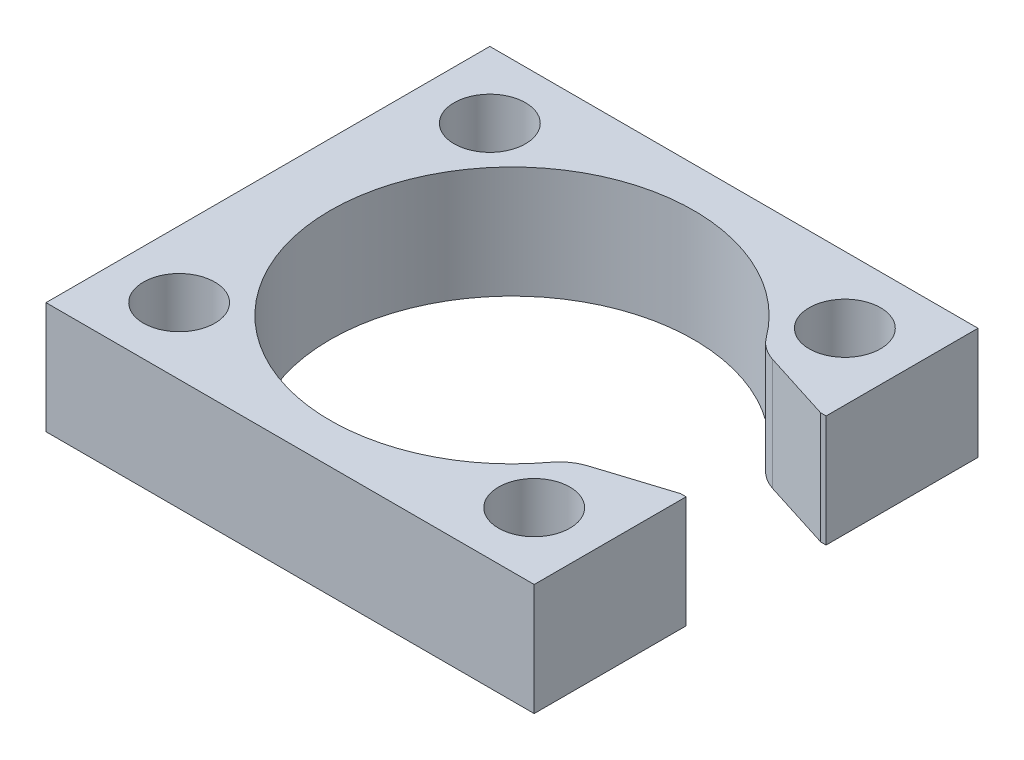
ISO-10303-21;
HEADER;
FILE_DESCRIPTION(('STEP AP214'),'2;1');
FILE_NAME('part.step','',(''),(''),'','','');
FILE_SCHEMA(('AUTOMOTIVE_DESIGN { 1 0 10303 214 1 1 1 1 }'));
ENDSEC;
DATA;
#1=APPLICATION_CONTEXT('core data for automotive mechanical design processes');
#2=APPLICATION_PROTOCOL_DEFINITION('international standard','automotive_design',2000,#1);
#3=PRODUCT_CONTEXT('',#1,'mechanical');
#4=PRODUCT('Part','Part','',(#3));
#5=PRODUCT_RELATED_PRODUCT_CATEGORY('part','',(#4));
#6=PRODUCT_DEFINITION_FORMATION('','',#4);
#7=PRODUCT_DEFINITION_CONTEXT('part definition',#1,'design');
#8=PRODUCT_DEFINITION('design','',#6,#7);
#9=PRODUCT_DEFINITION_SHAPE('','',#8);
#10=(LENGTH_UNIT() NAMED_UNIT(*) SI_UNIT(.MILLI.,.METRE.));
#11=(NAMED_UNIT(*) PLANE_ANGLE_UNIT() SI_UNIT($,.RADIAN.));
#12=(NAMED_UNIT(*) SI_UNIT($,.STERADIAN.) SOLID_ANGLE_UNIT());
#13=UNCERTAINTY_MEASURE_WITH_UNIT(LENGTH_MEASURE(1.E-05),#10,'distance_accuracy_value','');
#14=(GEOMETRIC_REPRESENTATION_CONTEXT(3) GLOBAL_UNCERTAINTY_ASSIGNED_CONTEXT((#13)) GLOBAL_UNIT_ASSIGNED_CONTEXT((#10,
#11,#12)) REPRESENTATION_CONTEXT('',''));
#15=CARTESIAN_POINT('',(0.,0.,0.));
#16=DIRECTION('',(0.,0.,1.));
#17=DIRECTION('',(1.,0.,0.));
#18=AXIS2_PLACEMENT_3D('',#15,#16,#17);
#19=CARTESIAN_POINT('',(17.4625,4.,15.875));
#20=DIRECTION('',(-1.,0.,0.));
#21=DIRECTION('',(0.,0.,1.));
#22=AXIS2_PLACEMENT_3D('',#19,#20,#21);
#23=PLANE('',#22);
#24=DIRECTION('',(0.,0.,-1.));
#25=VECTOR('',#24,1.);
#26=CARTESIAN_POINT('',(17.4625,4.,15.875));
#27=LINE('',#26,#25);
#28=CARTESIAN_POINT('',(17.4625,4.,-5.008));
#29=VERTEX_POINT('',#28);
#30=CARTESIAN_POINT('',(17.4625,4.,-15.875));
#31=VERTEX_POINT('',#30);
#32=EDGE_CURVE('E153',#29,#31,#27,.T.);
#33=ORIENTED_EDGE('',*,*,#32,.F.);
#34=DIRECTION('',(0.,1.,0.));
#35=VECTOR('',#34,1.);
#36=CARTESIAN_POINT('',(17.4625,-4.001,-5.008));
#37=LINE('',#36,#35);
#38=CARTESIAN_POINT('',(17.4625,-4.,-5.008));
#39=VERTEX_POINT('',#38);
#40=EDGE_CURVE('E146',#39,#29,#37,.T.);
#41=ORIENTED_EDGE('',*,*,#40,.F.);
#42=DIRECTION('',(0.,0.,-1.));
#43=VECTOR('',#42,1.);
#44=CARTESIAN_POINT('',(17.4625,-4.,15.875));
#45=LINE('',#44,#43);
#46=CARTESIAN_POINT('',(17.4625,-4.,-15.875));
#47=VERTEX_POINT('',#46);
#48=EDGE_CURVE('E167',#39,#47,#45,.T.);
#49=ORIENTED_EDGE('',*,*,#48,.T.);
#50=DIRECTION('',(0.,-1.,0.));
#51=VECTOR('',#50,1.);
#52=CARTESIAN_POINT('',(17.4625,4.,-15.875));
#53=LINE('',#52,#51);
#54=EDGE_CURVE('E179',#31,#47,#53,.T.);
#55=ORIENTED_EDGE('',*,*,#54,.F.);
#56=EDGE_LOOP('',(#33,#41,#49,#55));
#57=FACE_BOUND('',#56,.T.);
#58=ADVANCED_FACE('F33',(#57),#23,.F.);
#59=CARTESIAN_POINT('',(17.4625,-4.,15.875));
#60=VERTEX_POINT('',#59);
#61=CARTESIAN_POINT('',(17.4625,-4.,5.008));
#62=VERTEX_POINT('',#61);
#63=EDGE_CURVE('E145',#60,#62,#45,.T.);
#64=ORIENTED_EDGE('',*,*,#63,.T.);
#65=DIRECTION('',(0.,-1.,0.));
#66=VECTOR('',#65,1.);
#67=CARTESIAN_POINT('',(17.4625,-4.001,5.008));
#68=LINE('',#67,#66);
#69=CARTESIAN_POINT('',(17.4625,4.,5.008));
#70=VERTEX_POINT('',#69);
#71=EDGE_CURVE('E128',#70,#62,#68,.T.);
#72=ORIENTED_EDGE('',*,*,#71,.F.);
#73=CARTESIAN_POINT('',(17.4625,4.,15.875));
#74=VERTEX_POINT('',#73);
#75=EDGE_CURVE('E143',#74,#70,#27,.T.);
#76=ORIENTED_EDGE('',*,*,#75,.F.);
#77=DIRECTION('',(0.,-1.,0.));
#78=VECTOR('',#77,1.);
#79=CARTESIAN_POINT('',(17.4625,4.,15.875));
#80=LINE('',#79,#78);
#81=EDGE_CURVE('E164',#74,#60,#80,.T.);
#82=ORIENTED_EDGE('',*,*,#81,.T.);
#83=EDGE_LOOP('',(#64,#72,#76,#82));
#84=FACE_BOUND('',#83,.T.);
#85=ADVANCED_FACE('F141',(#84),#23,.F.);
#86=CARTESIAN_POINT('',(-17.4625,4.,-15.875));
#87=DIRECTION('',(0.,0.,1.));
#88=DIRECTION('',(1.,0.,0.));
#89=AXIS2_PLACEMENT_3D('',#86,#87,#88);
#90=PLANE('',#89);
#91=DIRECTION('',(-1.,0.,0.));
#92=VECTOR('',#91,1.);
#93=CARTESIAN_POINT('',(-17.4625,-4.,-15.875));
#94=LINE('',#93,#92);
#95=CARTESIAN_POINT('',(-17.4625,-4.,-15.875));
#96=VERTEX_POINT('',#95);
#97=EDGE_CURVE('E166',#47,#96,#94,.T.);
#98=ORIENTED_EDGE('',*,*,#97,.T.);
#99=DIRECTION('',(0.,-1.,0.));
#100=VECTOR('',#99,1.);
#101=CARTESIAN_POINT('',(-17.4625,4.,-15.875));
#102=LINE('',#101,#100);
#103=CARTESIAN_POINT('',(-17.4625,4.,-15.875));
#104=VERTEX_POINT('',#103);
#105=EDGE_CURVE('E176',#104,#96,#102,.T.);
#106=ORIENTED_EDGE('',*,*,#105,.F.);
#107=DIRECTION('',(-1.,0.,0.));
#108=VECTOR('',#107,1.);
#109=CARTESIAN_POINT('',(-17.4625,4.,-15.875));
#110=LINE('',#109,#108);
#111=EDGE_CURVE('E152',#31,#104,#110,.T.);
#112=ORIENTED_EDGE('',*,*,#111,.F.);
#113=ORIENTED_EDGE('',*,*,#54,.T.);
#114=EDGE_LOOP('',(#98,#106,#112,#113));
#115=FACE_BOUND('',#114,.T.);
#116=ADVANCED_FACE('F261',(#115),#90,.F.);
#117=CARTESIAN_POINT('',(-17.4625,4.,15.875));
#118=DIRECTION('',(1.,0.,0.));
#119=DIRECTION('',(0.,0.,-1.));
#120=AXIS2_PLACEMENT_3D('',#117,#118,#119);
#121=PLANE('',#120);
#122=DIRECTION('',(0.,0.,1.));
#123=VECTOR('',#122,1.);
#124=CARTESIAN_POINT('',(-17.4625,-4.,15.875));
#125=LINE('',#124,#123);
#126=CARTESIAN_POINT('',(-17.4625,-4.,15.875));
#127=VERTEX_POINT('',#126);
#128=EDGE_CURVE('E169',#96,#127,#125,.T.);
#129=ORIENTED_EDGE('',*,*,#128,.T.);
#130=DIRECTION('',(0.,-1.,0.));
#131=VECTOR('',#130,1.);
#132=CARTESIAN_POINT('',(-17.4625,4.,15.875));
#133=LINE('',#132,#131);
#134=CARTESIAN_POINT('',(-17.4625,4.,15.875));
#135=VERTEX_POINT('',#134);
#136=EDGE_CURVE('E173',#135,#127,#133,.T.);
#137=ORIENTED_EDGE('',*,*,#136,.F.);
#138=DIRECTION('',(0.,0.,1.));
#139=VECTOR('',#138,1.);
#140=CARTESIAN_POINT('',(-17.4625,4.,15.875));
#141=LINE('',#140,#139);
#142=EDGE_CURVE('E155',#104,#135,#141,.T.);
#143=ORIENTED_EDGE('',*,*,#142,.F.);
#144=ORIENTED_EDGE('',*,*,#105,.T.);
#145=EDGE_LOOP('',(#129,#137,#143,#144));
#146=FACE_BOUND('',#145,.T.);
#147=ADVANCED_FACE('F411',(#146),#121,.F.);
#148=CARTESIAN_POINT('',(-17.4625,4.,15.875));
#149=DIRECTION('',(0.,0.,-1.));
#150=DIRECTION('',(-1.,0.,0.));
#151=AXIS2_PLACEMENT_3D('',#148,#149,#150);
#152=PLANE('',#151);
#153=DIRECTION('',(1.,0.,0.));
#154=VECTOR('',#153,1.);
#155=CARTESIAN_POINT('',(-17.4625,-4.,15.875));
#156=LINE('',#155,#154);
#157=EDGE_CURVE('E157',#127,#60,#156,.T.);
#158=ORIENTED_EDGE('',*,*,#157,.T.);
#159=ORIENTED_EDGE('',*,*,#81,.F.);
#160=DIRECTION('',(1.,0.,0.));
#161=VECTOR('',#160,1.);
#162=CARTESIAN_POINT('',(-17.4625,4.,15.875));
#163=LINE('',#162,#161);
#164=EDGE_CURVE('E150',#135,#74,#163,.T.);
#165=ORIENTED_EDGE('',*,*,#164,.F.);
#166=ORIENTED_EDGE('',*,*,#136,.T.);
#167=EDGE_LOOP('',(#158,#159,#165,#166));
#168=FACE_BOUND('',#167,.T.);
#169=ADVANCED_FACE('F339',(#168),#152,.F.);
#170=CARTESIAN_POINT('',(0.,4.,0.));
#171=DIRECTION('',(0.,-1.,0.));
#172=DIRECTION('',(0.,0.,-1.));
#173=AXIS2_PLACEMENT_3D('',#170,#171,#172);
#174=PLANE('',#173);
#175=CARTESIAN_POINT('',(-12.7,4.,-11.1125));
#176=DIRECTION('',(0.,1.,0.));
#177=DIRECTION('',(0.,0.,1.));
#178=AXIS2_PLACEMENT_3D('',#175,#176,#177);
#179=CIRCLE('',#178,2.5527);
#180=CARTESIAN_POINT('',(-12.7,4.,-8.5598));
#181=VERTEX_POINT('',#180);
#182=EDGE_CURVE('E205',#181,#181,#179,.T.);
#183=ORIENTED_EDGE('',*,*,#182,.F.);
#184=EDGE_LOOP('',(#183));
#185=FACE_BOUND('',#184,.T.);
#186=CARTESIAN_POINT('',(12.7,4.,-11.1125));
#187=DIRECTION('',(0.,1.,0.));
#188=DIRECTION('',(0.,0.,1.));
#189=AXIS2_PLACEMENT_3D('',#186,#187,#188);
#190=CIRCLE('',#189,2.5527);
#191=CARTESIAN_POINT('',(12.7,4.,-8.5598));
#192=VERTEX_POINT('',#191);
#193=EDGE_CURVE('E232',#192,#192,#190,.T.);
#194=ORIENTED_EDGE('',*,*,#193,.F.);
#195=EDGE_LOOP('',(#194));
#196=FACE_BOUND('',#195,.T.);
#197=CARTESIAN_POINT('',(12.7,4.,11.1125));
#198=DIRECTION('',(0.,1.,0.));
#199=DIRECTION('',(0.,0.,1.));
#200=AXIS2_PLACEMENT_3D('',#197,#198,#199);
#201=CIRCLE('',#200,2.5527);
#202=CARTESIAN_POINT('',(12.7,4.,13.6652));
#203=VERTEX_POINT('',#202);
#204=EDGE_CURVE('E238',#203,#203,#201,.T.);
#205=ORIENTED_EDGE('',*,*,#204,.F.);
#206=EDGE_LOOP('',(#205));
#207=FACE_BOUND('',#206,.T.);
#208=CARTESIAN_POINT('',(-12.7,4.,11.1125));
#209=DIRECTION('',(0.,1.,0.));
#210=DIRECTION('',(0.,0.,1.));
#211=AXIS2_PLACEMENT_3D('',#208,#209,#210);
#212=CIRCLE('',#211,2.5527);
#213=CARTESIAN_POINT('',(-12.7,4.,13.6652));
#214=VERTEX_POINT('',#213);
#215=EDGE_CURVE('E243',#214,#214,#212,.T.);
#216=ORIENTED_EDGE('',*,*,#215,.F.);
#217=EDGE_LOOP('',(#216));
#218=FACE_BOUND('',#217,.T.);
#219=DIRECTION('',(0.953440193148594,0.,-0.301582158107491));
#220=VECTOR('',#219,1.);
#221=CARTESIAN_POINT('',(17.0784276564268,4.,5.008));
#222=LINE('',#221,#220);
#223=CARTESIAN_POINT('',(12.0519819566754,4.,6.59791235384693));
#224=VERTEX_POINT('',#223);
#225=CARTESIAN_POINT('',(17.0784276564268,4.,5.008));
#226=VERTEX_POINT('',#225);
#227=EDGE_CURVE('E136',#224,#226,#222,.T.);
#228=ORIENTED_EDGE('',*,*,#227,.F.);
#229=CARTESIAN_POINT('',(13.0095053086667,4.,9.62508496709372));
#230=DIRECTION('',(0.,-1.,0.));
#231=DIRECTION('',(0.,0.,-1.));
#232=AXIS2_PLACEMENT_3D('',#229,#230,#231);
#233=CIRCLE('',#232,3.175);
#234=CARTESIAN_POINT('',(10.457124454992,4.,7.73670550898814));
#235=VERTEX_POINT('',#234);
#236=EDGE_CURVE('E187',#224,#235,#233,.F.);
#237=ORIENTED_EDGE('',*,*,#236,.T.);
#238=CARTESIAN_POINT('',(0.,4.,0.));
#239=DIRECTION('',(0.,1.,0.));
#240=DIRECTION('',(0.,0.,1.));
#241=AXIS2_PLACEMENT_3D('',#238,#239,#240);
#242=CIRCLE('',#241,13.008);
#243=CARTESIAN_POINT('',(10.457124454992,4.,-7.73670550898814));
#244=VERTEX_POINT('',#243);
#245=EDGE_CURVE('E210',#244,#235,#242,.T.);
#246=ORIENTED_EDGE('',*,*,#245,.F.);
#247=CARTESIAN_POINT('',(13.0095053086667,4.,-9.62508496709372));
#248=DIRECTION('',(0.,-1.,0.));
#249=DIRECTION('',(0.,0.,-1.));
#250=AXIS2_PLACEMENT_3D('',#247,#248,#249);
#251=CIRCLE('',#250,3.175);
#252=CARTESIAN_POINT('',(12.0519819566754,4.,-6.59791235384694));
#253=VERTEX_POINT('',#252);
#254=EDGE_CURVE('E185',#244,#253,#251,.F.);
#255=ORIENTED_EDGE('',*,*,#254,.T.);
#256=DIRECTION('',(-0.953440193148594,0.,-0.301582158107492));
#257=VECTOR('',#256,1.);
#258=CARTESIAN_POINT('',(11.0098691627524,4.,-6.92754249493093));
#259=LINE('',#258,#257);
#260=CARTESIAN_POINT('',(17.0784276564268,4.,-5.008));
#261=VERTEX_POINT('',#260);
#262=EDGE_CURVE('E223',#261,#253,#259,.T.);
#263=ORIENTED_EDGE('',*,*,#262,.F.);
#264=DIRECTION('',(-1.,0.,0.));
#265=VECTOR('',#264,1.);
#266=CARTESIAN_POINT('',(17.0784276564268,4.,-5.008));
#267=LINE('',#266,#265);
#268=EDGE_CURVE('E135',#29,#261,#267,.T.);
#269=ORIENTED_EDGE('',*,*,#268,.F.);
#270=ORIENTED_EDGE('',*,*,#32,.T.);
#271=ORIENTED_EDGE('',*,*,#111,.T.);
#272=ORIENTED_EDGE('',*,*,#142,.T.);
#273=ORIENTED_EDGE('',*,*,#164,.T.);
#274=ORIENTED_EDGE('',*,*,#75,.T.);
#275=DIRECTION('',(1.,0.,0.));
#276=VECTOR('',#275,1.);
#277=CARTESIAN_POINT('',(22.733,4.,5.008));
#278=LINE('',#277,#276);
#279=EDGE_CURVE('E124',#226,#70,#278,.T.);
#280=ORIENTED_EDGE('',*,*,#279,.F.);
#281=EDGE_LOOP('',(#228,#237,#246,#255,#263,#269,#270,#271,#272,#273,#274,#280));
#282=FACE_BOUND('',#281,.T.);
#283=ADVANCED_FACE('F148',(#185,#196,#207,#218,#282),#174,.F.);
#284=CARTESIAN_POINT('',(0.,-4.,0.));
#285=DIRECTION('',(0.,-1.,0.));
#286=DIRECTION('',(0.,0.,-1.));
#287=AXIS2_PLACEMENT_3D('',#284,#285,#286);
#288=PLANE('',#287);
#289=CARTESIAN_POINT('',(0.,-4.,0.));
#290=DIRECTION('',(0.,-1.,0.));
#291=DIRECTION('',(0.,0.,-1.));
#292=AXIS2_PLACEMENT_3D('',#289,#290,#291);
#293=CIRCLE('',#292,13.008);
#294=CARTESIAN_POINT('',(10.457124454992,-4.,-7.73670550898814));
#295=VERTEX_POINT('',#294);
#296=CARTESIAN_POINT('',(10.457124454992,-4.,7.73670550898814));
#297=VERTEX_POINT('',#296);
#298=EDGE_CURVE('E200',#295,#297,#293,.F.);
#299=ORIENTED_EDGE('',*,*,#298,.T.);
#300=CARTESIAN_POINT('',(13.0095053086667,-4.,9.62508496709372));
#301=DIRECTION('',(0.,-1.,0.));
#302=DIRECTION('',(0.,0.,-1.));
#303=AXIS2_PLACEMENT_3D('',#300,#301,#302);
#304=CIRCLE('',#303,3.175);
#305=CARTESIAN_POINT('',(12.0519819566754,-4.,6.59791235384693));
#306=VERTEX_POINT('',#305);
#307=EDGE_CURVE('E41',#297,#306,#304,.T.);
#308=ORIENTED_EDGE('',*,*,#307,.T.);
#309=DIRECTION('',(0.953440193148594,0.,-0.301582158107491));
#310=VECTOR('',#309,1.);
#311=CARTESIAN_POINT('',(17.0784276564268,-4.,5.008));
#312=LINE('',#311,#310);
#313=CARTESIAN_POINT('',(17.0784276564268,-4.,5.008));
#314=VERTEX_POINT('',#313);
#315=EDGE_CURVE('E199',#306,#314,#312,.T.);
#316=ORIENTED_EDGE('',*,*,#315,.T.);
#317=DIRECTION('',(1.,0.,0.));
#318=VECTOR('',#317,1.);
#319=CARTESIAN_POINT('',(22.733,-4.,5.008));
#320=LINE('',#319,#318);
#321=EDGE_CURVE('E268',#314,#62,#320,.T.);
#322=ORIENTED_EDGE('',*,*,#321,.T.);
#323=ORIENTED_EDGE('',*,*,#63,.F.);
#324=ORIENTED_EDGE('',*,*,#157,.F.);
#325=ORIENTED_EDGE('',*,*,#128,.F.);
#326=ORIENTED_EDGE('',*,*,#97,.F.);
#327=ORIENTED_EDGE('',*,*,#48,.F.);
#328=DIRECTION('',(-1.,0.,0.));
#329=VECTOR('',#328,1.);
#330=CARTESIAN_POINT('',(17.0784276564268,-4.,-5.008));
#331=LINE('',#330,#329);
#332=CARTESIAN_POINT('',(17.0784276564268,-4.,-5.008));
#333=VERTEX_POINT('',#332);
#334=EDGE_CURVE('E213',#39,#333,#331,.T.);
#335=ORIENTED_EDGE('',*,*,#334,.T.);
#336=DIRECTION('',(-0.953440193148594,0.,-0.301582158107492));
#337=VECTOR('',#336,1.);
#338=CARTESIAN_POINT('',(11.0098691627524,-4.,-6.92754249493093));
#339=LINE('',#338,#337);
#340=CARTESIAN_POINT('',(12.0519819566754,-4.,-6.59791235384694));
#341=VERTEX_POINT('',#340);
#342=EDGE_CURVE('E217',#333,#341,#339,.T.);
#343=ORIENTED_EDGE('',*,*,#342,.T.);
#344=CARTESIAN_POINT('',(13.0095053086667,-4.,-9.62508496709372));
#345=DIRECTION('',(0.,-1.,0.));
#346=DIRECTION('',(0.,0.,-1.));
#347=AXIS2_PLACEMENT_3D('',#344,#345,#346);
#348=CIRCLE('',#347,3.175);
#349=EDGE_CURVE('E193',#341,#295,#348,.T.);
#350=ORIENTED_EDGE('',*,*,#349,.T.);
#351=EDGE_LOOP('',(#299,#308,#316,#322,#323,#324,#325,#326,#327,#335,#343,#350));
#352=FACE_BOUND('',#351,.T.);
#353=CARTESIAN_POINT('',(-12.7,-4.,-11.1125));
#354=DIRECTION('',(0.,1.,0.));
#355=DIRECTION('',(0.,0.,1.));
#356=AXIS2_PLACEMENT_3D('',#353,#354,#355);
#357=CIRCLE('',#356,2.5527);
#358=CARTESIAN_POINT('',(-12.7,-4.,-8.5598));
#359=VERTEX_POINT('',#358);
#360=EDGE_CURVE('E229',#359,#359,#357,.T.);
#361=ORIENTED_EDGE('',*,*,#360,.T.);
#362=EDGE_LOOP('',(#361));
#363=FACE_BOUND('',#362,.T.);
#364=CARTESIAN_POINT('',(12.7,-4.,-11.1125));
#365=DIRECTION('',(0.,1.,0.));
#366=DIRECTION('',(0.,0.,1.));
#367=AXIS2_PLACEMENT_3D('',#364,#365,#366);
#368=CIRCLE('',#367,2.5527);
#369=CARTESIAN_POINT('',(12.7,-4.,-8.5598));
#370=VERTEX_POINT('',#369);
#371=EDGE_CURVE('E235',#370,#370,#368,.T.);
#372=ORIENTED_EDGE('',*,*,#371,.T.);
#373=EDGE_LOOP('',(#372));
#374=FACE_BOUND('',#373,.T.);
#375=CARTESIAN_POINT('',(12.7,-4.,11.1125));
#376=DIRECTION('',(0.,1.,0.));
#377=DIRECTION('',(0.,0.,1.));
#378=AXIS2_PLACEMENT_3D('',#375,#376,#377);
#379=CIRCLE('',#378,2.5527);
#380=CARTESIAN_POINT('',(12.7,-4.,13.6652));
#381=VERTEX_POINT('',#380);
#382=EDGE_CURVE('E241',#381,#381,#379,.T.);
#383=ORIENTED_EDGE('',*,*,#382,.T.);
#384=EDGE_LOOP('',(#383));
#385=FACE_BOUND('',#384,.T.);
#386=CARTESIAN_POINT('',(-12.7,-4.,11.1125));
#387=DIRECTION('',(0.,1.,0.));
#388=DIRECTION('',(0.,0.,1.));
#389=AXIS2_PLACEMENT_3D('',#386,#387,#388);
#390=CIRCLE('',#389,2.5527);
#391=CARTESIAN_POINT('',(-12.7,-4.,13.6652));
#392=VERTEX_POINT('',#391);
#393=EDGE_CURVE('E159',#392,#392,#390,.T.);
#394=ORIENTED_EDGE('',*,*,#393,.T.);
#395=EDGE_LOOP('',(#394));
#396=FACE_BOUND('',#395,.T.);
#397=ADVANCED_FACE('F197',(#352,#363,#374,#385,#396),#288,.T.);
#398=CARTESIAN_POINT('',(-12.7,4.,11.1125));
#399=DIRECTION('',(0.,1.,0.));
#400=DIRECTION('',(0.,0.,1.));
#401=AXIS2_PLACEMENT_3D('',#398,#399,#400);
#402=CYLINDRICAL_SURFACE('',#401,2.5527);
#403=ORIENTED_EDGE('',*,*,#393,.F.);
#404=EDGE_LOOP('',(#403));
#405=FACE_BOUND('',#404,.T.);
#406=ORIENTED_EDGE('',*,*,#215,.T.);
#407=EDGE_LOOP('',(#406));
#408=FACE_BOUND('',#407,.T.);
#409=ADVANCED_FACE('F328',(#405,#408),#402,.F.);
#410=CARTESIAN_POINT('',(12.7,4.,11.1125));
#411=DIRECTION('',(0.,1.,0.));
#412=DIRECTION('',(0.,0.,1.));
#413=AXIS2_PLACEMENT_3D('',#410,#411,#412);
#414=CYLINDRICAL_SURFACE('',#413,2.5527);
#415=ORIENTED_EDGE('',*,*,#382,.F.);
#416=EDGE_LOOP('',(#415));
#417=FACE_BOUND('',#416,.T.);
#418=ORIENTED_EDGE('',*,*,#204,.T.);
#419=EDGE_LOOP('',(#418));
#420=FACE_BOUND('',#419,.T.);
#421=ADVANCED_FACE('F387',(#417,#420),#414,.F.);
#422=CARTESIAN_POINT('',(12.7,4.,-11.1125));
#423=DIRECTION('',(0.,1.,0.));
#424=DIRECTION('',(0.,0.,1.));
#425=AXIS2_PLACEMENT_3D('',#422,#423,#424);
#426=CYLINDRICAL_SURFACE('',#425,2.5527);
#427=ORIENTED_EDGE('',*,*,#371,.F.);
#428=EDGE_LOOP('',(#427));
#429=FACE_BOUND('',#428,.T.);
#430=ORIENTED_EDGE('',*,*,#193,.T.);
#431=EDGE_LOOP('',(#430));
#432=FACE_BOUND('',#431,.T.);
#433=ADVANCED_FACE('F377',(#429,#432),#426,.F.);
#434=CARTESIAN_POINT('',(-12.7,4.,-11.1125));
#435=DIRECTION('',(0.,1.,0.));
#436=DIRECTION('',(0.,0.,1.));
#437=AXIS2_PLACEMENT_3D('',#434,#435,#436);
#438=CYLINDRICAL_SURFACE('',#437,2.5527);
#439=ORIENTED_EDGE('',*,*,#360,.F.);
#440=EDGE_LOOP('',(#439));
#441=FACE_BOUND('',#440,.T.);
#442=ORIENTED_EDGE('',*,*,#182,.T.);
#443=EDGE_LOOP('',(#442));
#444=FACE_BOUND('',#443,.T.);
#445=ADVANCED_FACE('F357',(#441,#444),#438,.F.);
#446=CARTESIAN_POINT('',(17.0784276564268,-4.001,-5.008));
#447=DIRECTION('',(0.,0.,-1.));
#448=DIRECTION('',(-1.,0.,0.));
#449=AXIS2_PLACEMENT_3D('',#446,#447,#448);
#450=PLANE('',#449);
#451=ORIENTED_EDGE('',*,*,#40,.T.);
#452=ORIENTED_EDGE('',*,*,#268,.T.);
#453=DIRECTION('',(0.,1.,0.));
#454=VECTOR('',#453,1.);
#455=CARTESIAN_POINT('',(17.0784276564268,-4.001,-5.008));
#456=LINE('',#455,#454);
#457=EDGE_CURVE('E206',#333,#261,#456,.T.);
#458=ORIENTED_EDGE('',*,*,#457,.F.);
#459=ORIENTED_EDGE('',*,*,#334,.F.);
#460=EDGE_LOOP('',(#451,#452,#458,#459));
#461=FACE_BOUND('',#460,.T.);
#462=ADVANCED_FACE('F267',(#461),#450,.F.);
#463=CARTESIAN_POINT('',(22.733,-4.001,5.008));
#464=DIRECTION('',(0.,0.,1.));
#465=DIRECTION('',(1.,0.,0.));
#466=AXIS2_PLACEMENT_3D('',#463,#464,#465);
#467=PLANE('',#466);
#468=ORIENTED_EDGE('',*,*,#71,.T.);
#469=ORIENTED_EDGE('',*,*,#321,.F.);
#470=DIRECTION('',(0.,1.,0.));
#471=VECTOR('',#470,1.);
#472=CARTESIAN_POINT('',(17.0784276564268,-4.001,5.008));
#473=LINE('',#472,#471);
#474=EDGE_CURVE('E131',#314,#226,#473,.T.);
#475=ORIENTED_EDGE('',*,*,#474,.T.);
#476=ORIENTED_EDGE('',*,*,#279,.T.);
#477=EDGE_LOOP('',(#468,#469,#475,#476));
#478=FACE_BOUND('',#477,.T.);
#479=ADVANCED_FACE('F126',(#478),#467,.F.);
#480=CARTESIAN_POINT('',(0.,-4.001,0.));
#481=DIRECTION('',(0.,1.,0.));
#482=DIRECTION('',(0.,0.,1.));
#483=AXIS2_PLACEMENT_3D('',#480,#481,#482);
#484=CYLINDRICAL_SURFACE('',#483,13.008);
#485=ORIENTED_EDGE('',*,*,#245,.T.);
#486=DIRECTION('',(0.,1.,0.));
#487=VECTOR('',#486,1.);
#488=CARTESIAN_POINT('',(10.457124454992,-4.001,7.73670550898814));
#489=LINE('',#488,#487);
#490=EDGE_CURVE('E54',#235,#297,#489,.F.);
#491=ORIENTED_EDGE('',*,*,#490,.T.);
#492=ORIENTED_EDGE('',*,*,#298,.F.);
#493=DIRECTION('',(0.,1.,0.));
#494=VECTOR('',#493,1.);
#495=CARTESIAN_POINT('',(10.457124454992,-4.001,-7.73670550898814));
#496=LINE('',#495,#494);
#497=EDGE_CURVE('E189',#295,#244,#496,.T.);
#498=ORIENTED_EDGE('',*,*,#497,.T.);
#499=EDGE_LOOP('',(#485,#491,#492,#498));
#500=FACE_BOUND('',#499,.T.);
#501=ADVANCED_FACE('F211',(#500),#484,.F.);
#502=CARTESIAN_POINT('',(11.0098691627524,-4.001,-6.92754249493093));
#503=DIRECTION('',(0.301582158107492,0.,-0.953440193148594));
#504=DIRECTION('',(-0.953440193148594,0.,-0.301582158107492));
#505=AXIS2_PLACEMENT_3D('',#502,#503,#504);
#506=PLANE('',#505);
#507=ORIENTED_EDGE('',*,*,#262,.T.);
#508=DIRECTION('',(0.,1.,0.));
#509=VECTOR('',#508,1.);
#510=CARTESIAN_POINT('',(12.0519819566754,-4.001,-6.59791235384694));
#511=LINE('',#510,#509);
#512=EDGE_CURVE('E11',#253,#341,#511,.F.);
#513=ORIENTED_EDGE('',*,*,#512,.T.);
#514=ORIENTED_EDGE('',*,*,#342,.F.);
#515=ORIENTED_EDGE('',*,*,#457,.T.);
#516=EDGE_LOOP('',(#507,#513,#514,#515));
#517=FACE_BOUND('',#516,.T.);
#518=ADVANCED_FACE('F274',(#517),#506,.F.);
#519=CARTESIAN_POINT('',(17.0784276564268,-4.001,5.008));
#520=DIRECTION('',(0.301582158107491,0.,0.953440193148594));
#521=DIRECTION('',(0.953440193148594,0.,-0.301582158107491));
#522=AXIS2_PLACEMENT_3D('',#519,#520,#521);
#523=PLANE('',#522);
#524=ORIENTED_EDGE('',*,*,#315,.F.);
#525=DIRECTION('',(0.,1.,0.));
#526=VECTOR('',#525,1.);
#527=CARTESIAN_POINT('',(12.0519819566754,-4.001,6.59791235384693));
#528=LINE('',#527,#526);
#529=EDGE_CURVE('E182',#306,#224,#528,.T.);
#530=ORIENTED_EDGE('',*,*,#529,.T.);
#531=ORIENTED_EDGE('',*,*,#227,.T.);
#532=ORIENTED_EDGE('',*,*,#474,.F.);
#533=EDGE_LOOP('',(#524,#530,#531,#532));
#534=FACE_BOUND('',#533,.T.);
#535=ADVANCED_FACE('F204',(#534),#523,.F.);
#536=CARTESIAN_POINT('',(13.0095053086667,-4.001,9.62508496709372));
#537=DIRECTION('',(0.,1.,0.));
#538=DIRECTION('',(0.,0.,1.));
#539=AXIS2_PLACEMENT_3D('',#536,#537,#538);
#540=CYLINDRICAL_SURFACE('',#539,3.175);
#541=ORIENTED_EDGE('',*,*,#307,.F.);
#542=ORIENTED_EDGE('',*,*,#490,.F.);
#543=ORIENTED_EDGE('',*,*,#236,.F.);
#544=ORIENTED_EDGE('',*,*,#529,.F.);
#545=EDGE_LOOP('',(#541,#542,#543,#544));
#546=FACE_BOUND('',#545,.T.);
#547=ADVANCED_FACE('F208',(#546),#540,.T.);
#548=CARTESIAN_POINT('',(13.0095053086667,-4.001,-9.62508496709372));
#549=DIRECTION('',(0.,1.,0.));
#550=DIRECTION('',(0.,0.,1.));
#551=AXIS2_PLACEMENT_3D('',#548,#549,#550);
#552=CYLINDRICAL_SURFACE('',#551,3.175);
#553=ORIENTED_EDGE('',*,*,#349,.F.);
#554=ORIENTED_EDGE('',*,*,#512,.F.);
#555=ORIENTED_EDGE('',*,*,#254,.F.);
#556=ORIENTED_EDGE('',*,*,#497,.F.);
#557=EDGE_LOOP('',(#553,#554,#555,#556));
#558=FACE_BOUND('',#557,.T.);
#559=ADVANCED_FACE('F35',(#558),#552,.T.);
#560=CLOSED_SHELL('',(#58,#85,#116,#147,#169,#283,#397,#409,#421,#433,#445,#462,#479,#501,#518,
#535,#547,#559));
#561=MANIFOLD_SOLID_BREP('B2',#560);
#562=ADVANCED_BREP_SHAPE_REPRESENTATION('',(#18,#561),#14);
#563=SHAPE_DEFINITION_REPRESENTATION(#9,#562);
ENDSEC;
END-ISO-10303-21;
